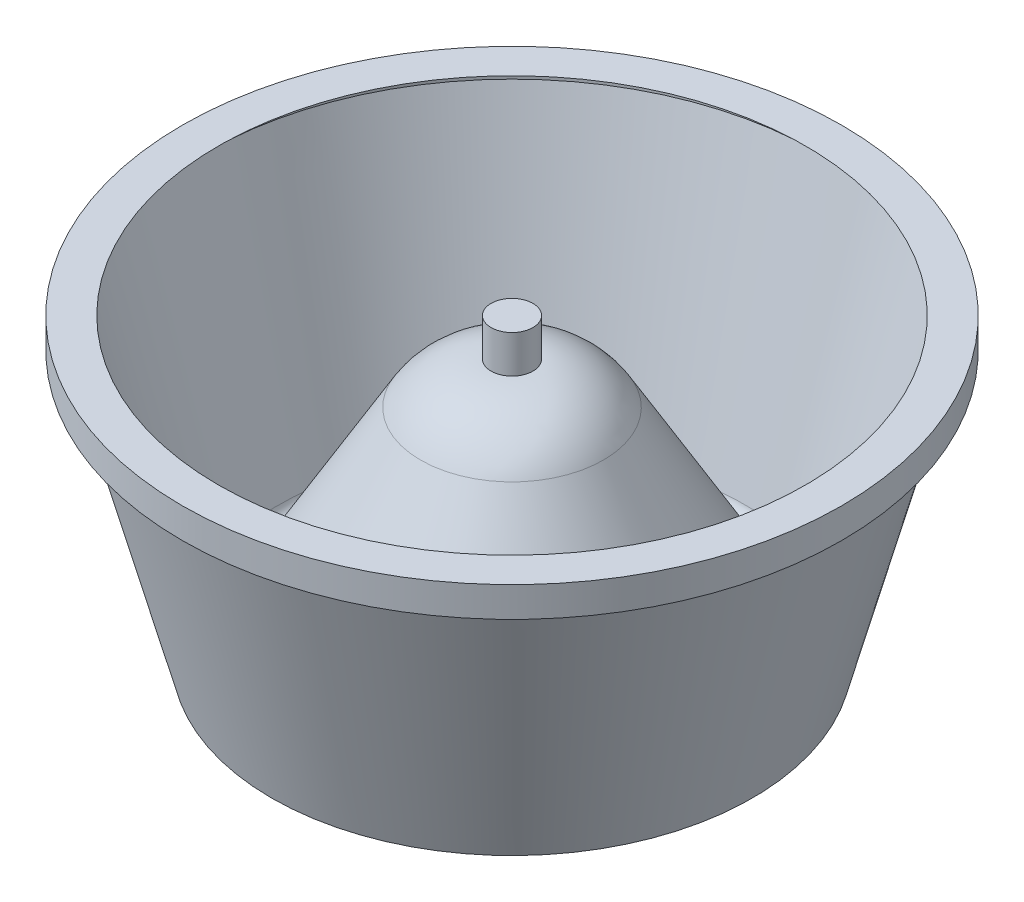
ISO-10303-21;
HEADER;
FILE_DESCRIPTION(('STEP AP214'),'2;1');
FILE_NAME('part.step','',(''),(''),'','','');
FILE_SCHEMA(('AUTOMOTIVE_DESIGN { 1 0 10303 214 1 1 1 1 }'));
ENDSEC;
DATA;
#1=APPLICATION_CONTEXT('core data for automotive mechanical design processes');
#2=APPLICATION_PROTOCOL_DEFINITION('international standard','automotive_design',2000,#1);
#3=PRODUCT_CONTEXT('',#1,'mechanical');
#4=PRODUCT('Part','Part','',(#3));
#5=PRODUCT_RELATED_PRODUCT_CATEGORY('part','',(#4));
#6=PRODUCT_DEFINITION_FORMATION('','',#4);
#7=PRODUCT_DEFINITION_CONTEXT('part definition',#1,'design');
#8=PRODUCT_DEFINITION('design','',#6,#7);
#9=PRODUCT_DEFINITION_SHAPE('','',#8);
#10=(LENGTH_UNIT() NAMED_UNIT(*) SI_UNIT(.MILLI.,.METRE.));
#11=(NAMED_UNIT(*) PLANE_ANGLE_UNIT() SI_UNIT($,.RADIAN.));
#12=(NAMED_UNIT(*) SI_UNIT($,.STERADIAN.) SOLID_ANGLE_UNIT());
#13=UNCERTAINTY_MEASURE_WITH_UNIT(LENGTH_MEASURE(1.E-05),#10,'distance_accuracy_value','');
#14=(GEOMETRIC_REPRESENTATION_CONTEXT(3) GLOBAL_UNCERTAINTY_ASSIGNED_CONTEXT((#13)) GLOBAL_UNIT_ASSIGNED_CONTEXT((#10,
#11,#12)) REPRESENTATION_CONTEXT('',''));
#15=CARTESIAN_POINT('',(0.,0.,0.));
#16=DIRECTION('',(0.,0.,1.));
#17=DIRECTION('',(1.,0.,0.));
#18=AXIS2_PLACEMENT_3D('',#15,#16,#17);
#19=CARTESIAN_POINT('',(0.,37.5,0.));
#20=DIRECTION('',(0.,1.,0.));
#21=DIRECTION('',(-0.00319420156689542,0.,0.999994898525163));
#22=AXIS2_PLACEMENT_3D('',#19,#20,#21);
#23=PLANE('',#22);
#24=CARTESIAN_POINT('',(0.,37.5,0.));
#25=DIRECTION('',(0.,1.,0.));
#26=DIRECTION('',(-0.00319420156689542,0.,0.999994898525163));
#27=AXIS2_PLACEMENT_3D('',#24,#25,#26);
#28=CIRCLE('',#27,80.);
#29=CARTESIAN_POINT('',(-0.255536125351645,37.5,79.999591882013));
#30=VERTEX_POINT('',#29);
#31=EDGE_CURVE('E50',#30,#30,#28,.T.);
#32=ORIENTED_EDGE('',*,*,#31,.T.);
#33=EDGE_LOOP('',(#32));
#34=FACE_BOUND('',#33,.T.);
#35=CARTESIAN_POINT('',(0.,37.5,0.));
#36=DIRECTION('',(0.,1.,0.));
#37=DIRECTION('',(0.,0.,1.));
#38=AXIS2_PLACEMENT_3D('',#35,#36,#37);
#39=CIRCLE('',#38,71.2513108531376);
#40=CARTESIAN_POINT('',(0.,37.5,71.2513108531377));
#41=VERTEX_POINT('',#40);
#42=EDGE_CURVE('E37',#41,#41,#39,.T.);
#43=ORIENTED_EDGE('',*,*,#42,.F.);
#44=EDGE_LOOP('',(#43));
#45=FACE_BOUND('',#44,.T.);
#46=ADVANCED_FACE('F33',(#34,#45),#23,.T.);
#47=CARTESIAN_POINT('',(0.,37.5,0.));
#48=DIRECTION('',(0.,1.,0.));
#49=DIRECTION('',(0.,0.,1.));
#50=AXIS2_PLACEMENT_3D('',#47,#48,#49);
#51=CIRCLE('',#50,5.07840908288413);
#52=CARTESIAN_POINT('',(0.,37.5,5.07840908288415));
#53=VERTEX_POINT('',#52);
#54=EDGE_CURVE('E53',#53,#53,#51,.T.);
#55=ORIENTED_EDGE('',*,*,#54,.T.);
#56=EDGE_LOOP('',(#55));
#57=FACE_BOUND('',#56,.T.);
#58=ADVANCED_FACE('F94',(#57),#23,.T.);
#59=CARTESIAN_POINT('',(0.,-29.7971455333949,0.));
#60=DIRECTION('',(0.,1.,0.));
#61=DIRECTION('',(0.,0.,1.));
#62=AXIS2_PLACEMENT_3D('',#59,#60,#61);
#63=TOROIDAL_SURFACE('',#62,53.6852904935057,3.);
#64=CARTESIAN_POINT('',(0.,-31.3094571423734,0.));
#65=DIRECTION('',(0.,1.,0.));
#66=DIRECTION('',(0.,0.,1.));
#67=AXIS2_PLACEMENT_3D('',#64,#65,#66);
#68=CIRCLE('',#67,51.0943613942541);
#69=CARTESIAN_POINT('',(0.,-31.3094571423734,51.0943613942541));
#70=VERTEX_POINT('',#69);
#71=EDGE_CURVE('E71',#70,#70,#68,.T.);
#72=ORIENTED_EDGE('',*,*,#71,.F.);
#73=EDGE_LOOP('',(#72));
#74=FACE_BOUND('',#73,.T.);
#75=CARTESIAN_POINT('',(0.,-30.5811702491781,0.));
#76=DIRECTION('',(0.,1.,0.));
#77=DIRECTION('',(0.,0.,1.));
#78=AXIS2_PLACEMENT_3D('',#75,#76,#77);
#79=CIRCLE('',#78,56.5810296469933);
#80=CARTESIAN_POINT('',(0.,-30.5811702491781,56.5810296469933));
#81=VERTEX_POINT('',#80);
#82=EDGE_CURVE('E74',#81,#81,#79,.T.);
#83=ORIENTED_EDGE('',*,*,#82,.T.);
#84=EDGE_LOOP('',(#83));
#85=FACE_BOUND('',#84,.T.);
#86=ADVANCED_FACE('F96',(#74,#85),#63,.F.);
#87=CARTESIAN_POINT('',(0.,-31.3094571423734,0.));
#88=DIRECTION('',(0.,-1.,0.));
#89=DIRECTION('',(0.,0.,-1.));
#90=AXIS2_PLACEMENT_3D('',#87,#88,#89);
#91=CONICAL_SURFACE('',#90,51.0943613942541,0.52834403413605);
#92=CARTESIAN_POINT('',(0.,18.2052123543031,0.));
#93=DIRECTION('',(0.,1.,0.));
#94=DIRECTION('',(0.,0.,1.));
#95=AXIS2_PLACEMENT_3D('',#92,#93,#94);
#96=CIRCLE('',#95,22.1929107462273);
#97=CARTESIAN_POINT('',(0.,18.2052123543031,22.1929107462273));
#98=VERTEX_POINT('',#97);
#99=EDGE_CURVE('E52',#98,#98,#96,.T.);
#100=ORIENTED_EDGE('',*,*,#99,.F.);
#101=EDGE_LOOP('',(#100));
#102=FACE_BOUND('',#101,.T.);
#103=ORIENTED_EDGE('',*,*,#71,.T.);
#104=EDGE_LOOP('',(#103));
#105=FACE_BOUND('',#104,.T.);
#106=ADVANCED_FACE('F105',(#102,#105),#91,.T.);
#107=CARTESIAN_POINT('',(0.,7.89657719946323,0.));
#108=DIRECTION('',(0.,1.,0.));
#109=DIRECTION('',(0.,0.,1.));
#110=AXIS2_PLACEMENT_3D('',#107,#108,#109);
#111=DEGENERATE_TOROIDAL_SURFACE('',#110,4.53190580672045,20.4494267457277,.T.);
#112=CARTESIAN_POINT('',(0.,28.3387000930873,0.));
#113=DIRECTION('',(0.,1.,0.));
#114=DIRECTION('',(0.,0.,1.));
#115=AXIS2_PLACEMENT_3D('',#112,#113,#114);
#116=CIRCLE('',#115,5.07840908288413);
#117=CARTESIAN_POINT('',(0.,28.3387000930873,5.07840908288415));
#118=VERTEX_POINT('',#117);
#119=EDGE_CURVE('E10',#118,#118,#116,.T.);
#120=ORIENTED_EDGE('',*,*,#119,.F.);
#121=EDGE_LOOP('',(#120));
#122=FACE_BOUND('',#121,.T.);
#123=ORIENTED_EDGE('',*,*,#99,.T.);
#124=EDGE_LOOP('',(#123));
#125=FACE_BOUND('',#124,.T.);
#126=ADVANCED_FACE('F112',(#122,#125),#111,.T.);
#127=CARTESIAN_POINT('',(0.,0.,0.));
#128=DIRECTION('',(0.,1.,0.));
#129=DIRECTION('',(0.,0.,1.));
#130=AXIS2_PLACEMENT_3D('',#127,#128,#129);
#131=CYLINDRICAL_SURFACE('',#130,5.07840908288413);
#132=ORIENTED_EDGE('',*,*,#54,.F.);
#133=EDGE_LOOP('',(#132));
#134=FACE_BOUND('',#133,.T.);
#135=ORIENTED_EDGE('',*,*,#119,.T.);
#136=EDGE_LOOP('',(#135));
#137=FACE_BOUND('',#136,.T.);
#138=ADVANCED_FACE('F120',(#134,#137),#131,.T.);
#139=CARTESIAN_POINT('',(0.,34.6650938751586,0.));
#140=DIRECTION('',(0.,1.,0.));
#141=DIRECTION('',(0.,0.,1.));
#142=AXIS2_PLACEMENT_3D('',#139,#140,#141);
#143=CONICAL_SURFACE('',#142,74.2465309143948,0.264411817054796);
#144=ORIENTED_EDGE('',*,*,#82,.F.);
#145=EDGE_LOOP('',(#144));
#146=FACE_BOUND('',#145,.T.);
#147=CARTESIAN_POINT('',(0.,34.6650938751586,0.));
#148=DIRECTION('',(0.,1.,0.));
#149=DIRECTION('',(0.,0.,1.));
#150=AXIS2_PLACEMENT_3D('',#147,#148,#149);
#151=CIRCLE('',#150,74.2465309143948);
#152=CARTESIAN_POINT('',(0.,34.6650938751585,74.2465309143948));
#153=VERTEX_POINT('',#152);
#154=EDGE_CURVE('E46',#153,#153,#151,.T.);
#155=ORIENTED_EDGE('',*,*,#154,.T.);
#156=EDGE_LOOP('',(#155));
#157=FACE_BOUND('',#156,.T.);
#158=ADVANCED_FACE('F79',(#146,#157),#143,.F.);
#159=CARTESIAN_POINT('',(0.,0.,0.));
#160=DIRECTION('',(0.,1.,0.));
#161=DIRECTION('',(0.,0.,1.));
#162=AXIS2_PLACEMENT_3D('',#159,#160,#161);
#163=CYLINDRICAL_SURFACE('',#162,74.2465309143948);
#164=ORIENTED_EDGE('',*,*,#154,.F.);
#165=EDGE_LOOP('',(#164));
#166=FACE_BOUND('',#165,.T.);
#167=CARTESIAN_POINT('',(0.,37.3932662954329,0.));
#168=DIRECTION('',(0.,1.,0.));
#169=DIRECTION('',(0.,0.,1.));
#170=AXIS2_PLACEMENT_3D('',#167,#168,#169);
#171=CIRCLE('',#170,74.2465309143948);
#172=CARTESIAN_POINT('',(0.,37.3932662954329,74.2465309143948));
#173=VERTEX_POINT('',#172);
#174=EDGE_CURVE('E41',#173,#173,#171,.T.);
#175=ORIENTED_EDGE('',*,*,#174,.T.);
#176=EDGE_LOOP('',(#175));
#177=FACE_BOUND('',#176,.T.);
#178=ADVANCED_FACE('F81',(#166,#177),#163,.F.);
#179=CARTESIAN_POINT('',(0.,37.5,0.));
#180=DIRECTION('',(0.,-1.,0.));
#181=DIRECTION('',(0.,0.,-1.));
#182=AXIS2_PLACEMENT_3D('',#179,#180,#181);
#183=CONICAL_SURFACE('',#182,71.2513108531376,1.53517671992909);
#184=ORIENTED_EDGE('',*,*,#174,.F.);
#185=EDGE_LOOP('',(#184));
#186=FACE_BOUND('',#185,.T.);
#187=ORIENTED_EDGE('',*,*,#42,.T.);
#188=EDGE_LOOP('',(#187));
#189=FACE_BOUND('',#188,.T.);
#190=ADVANCED_FACE('F84',(#186,#189),#183,.F.);
#191=CARTESIAN_POINT('',(0.,-34.7711569371554,0.));
#192=DIRECTION('',(0.,-1.,0.));
#193=DIRECTION('',(0.00319420156689542,0.,-0.999994898525163));
#194=AXIS2_PLACEMENT_3D('',#191,#192,#193);
#195=CYLINDRICAL_SURFACE('',#194,80.);
#196=CARTESIAN_POINT('',(0.,30.1928950130274,0.));
#197=DIRECTION('',(0.,1.,0.));
#198=DIRECTION('',(0.,0.,1.));
#199=AXIS2_PLACEMENT_3D('',#196,#197,#198);
#200=CIRCLE('',#199,80.);
#201=CARTESIAN_POINT('',(0.,30.1928950130274,80.));
#202=VERTEX_POINT('',#201);
#203=EDGE_CURVE('E55',#202,#202,#200,.T.);
#204=ORIENTED_EDGE('',*,*,#203,.T.);
#205=EDGE_LOOP('',(#204));
#206=FACE_BOUND('',#205,.T.);
#207=ORIENTED_EDGE('',*,*,#31,.F.);
#208=EDGE_LOOP('',(#207));
#209=FACE_BOUND('',#208,.T.);
#210=ADVANCED_FACE('F35',(#206,#209),#195,.T.);
#211=CARTESIAN_POINT('',(0.,30.1928950130274,80.));
#212=DIRECTION('',(0.,1.,0.));
#213=DIRECTION('',(0.,0.,1.));
#214=AXIS2_PLACEMENT_3D('',#211,#212,#213);
#215=PLANE('',#214);
#216=ORIENTED_EDGE('',*,*,#203,.F.);
#217=EDGE_LOOP('',(#216));
#218=FACE_BOUND('',#217,.T.);
#219=CARTESIAN_POINT('',(0.,30.1928950130274,0.));
#220=DIRECTION('',(0.,1.,0.));
#221=DIRECTION('',(0.,0.,1.));
#222=AXIS2_PLACEMENT_3D('',#219,#220,#221);
#223=CIRCLE('',#222,75.6331313512779);
#224=CARTESIAN_POINT('',(0.,30.1928950130274,75.6331313512779));
#225=VERTEX_POINT('',#224);
#226=EDGE_CURVE('E60',#225,#225,#223,.T.);
#227=ORIENTED_EDGE('',*,*,#226,.T.);
#228=EDGE_LOOP('',(#227));
#229=FACE_BOUND('',#228,.T.);
#230=ADVANCED_FACE('F101',(#218,#229),#215,.F.);
#231=CARTESIAN_POINT('',(0.,-34.7711569371554,0.));
#232=DIRECTION('',(0.,1.,0.));
#233=DIRECTION('',(0.,0.,1.));
#234=AXIS2_PLACEMENT_3D('',#231,#232,#233);
#235=CONICAL_SURFACE('',#234,58.3227315701756,0.260410563994633);
#236=ORIENTED_EDGE('',*,*,#226,.F.);
#237=EDGE_LOOP('',(#236));
#238=FACE_BOUND('',#237,.T.);
#239=CARTESIAN_POINT('',(0.,-34.7711569371554,0.));
#240=DIRECTION('',(0.,1.,0.));
#241=DIRECTION('',(0.,0.,1.));
#242=AXIS2_PLACEMENT_3D('',#239,#240,#241);
#243=CIRCLE('',#242,58.3227315701756);
#244=CARTESIAN_POINT('',(0.,-34.7711569371554,58.3227315701756));
#245=VERTEX_POINT('',#244);
#246=EDGE_CURVE('E65',#245,#245,#243,.T.);
#247=ORIENTED_EDGE('',*,*,#246,.T.);
#248=EDGE_LOOP('',(#247));
#249=FACE_BOUND('',#248,.T.);
#250=ADVANCED_FACE('F137',(#238,#249),#235,.T.);
#251=CARTESIAN_POINT('',(0.,-34.7711569371554,0.));
#252=DIRECTION('',(0.,1.,0.));
#253=DIRECTION('',(-0.00319420156689542,0.,0.999994898525163));
#254=AXIS2_PLACEMENT_3D('',#251,#252,#253);
#255=PLANE('',#254);
#256=CARTESIAN_POINT('',(0.,-34.7711569371554,0.));
#257=DIRECTION('',(0.,-1.,0.));
#258=DIRECTION('',(0.,0.,-1.));
#259=AXIS2_PLACEMENT_3D('',#256,#257,#258);
#260=CIRCLE('',#259,46.7761462288347);
#261=CARTESIAN_POINT('',(0.,-34.7711569371554,-46.7761462288347));
#262=VERTEX_POINT('',#261);
#263=EDGE_CURVE('E164',#262,#262,#260,.T.);
#264=ORIENTED_EDGE('',*,*,#263,.F.);
#265=EDGE_LOOP('',(#264));
#266=FACE_BOUND('',#265,.T.);
#267=ORIENTED_EDGE('',*,*,#246,.F.);
#268=EDGE_LOOP('',(#267));
#269=FACE_BOUND('',#268,.T.);
#270=ADVANCED_FACE('F133',(#266,#269),#255,.F.);
#271=CARTESIAN_POINT('',(0.,23.3404859260582,4.94478595423634));
#272=DIRECTION('',(0.,-1.,0.));
#273=DIRECTION('',(0.,0.,-1.));
#274=AXIS2_PLACEMENT_3D('',#271,#272,#273);
#275=PLANE('',#274);
#276=CARTESIAN_POINT('',(0.,23.3404859260582,0.));
#277=DIRECTION('',(0.,-1.,0.));
#278=DIRECTION('',(0.,0.,-1.));
#279=AXIS2_PLACEMENT_3D('',#276,#277,#278);
#280=CIRCLE('',#279,4.94478595423634);
#281=CARTESIAN_POINT('',(0.,23.3404859260582,-4.94478595423634));
#282=VERTEX_POINT('',#281);
#283=EDGE_CURVE('E171',#282,#282,#280,.T.);
#284=ORIENTED_EDGE('',*,*,#283,.T.);
#285=EDGE_LOOP('',(#284));
#286=FACE_BOUND('',#285,.T.);
#287=ADVANCED_FACE('F136',(#286),#275,.T.);
#288=CARTESIAN_POINT('',(0.,7.89657719946323,0.));
#289=DIRECTION('',(0.,-1.,0.));
#290=DIRECTION('',(0.,0.,-1.));
#291=AXIS2_PLACEMENT_3D('',#288,#289,#290);
#292=DEGENERATE_TOROIDAL_SURFACE('',#291,4.53190580672045,15.4494267457277,.T.);
#293=CARTESIAN_POINT('',(0.,15.6846930060055,0.));
#294=DIRECTION('',(0.,-1.,0.));
#295=DIRECTION('',(0.,0.,-1.));
#296=AXIS2_PLACEMENT_3D('',#293,#294,#295);
#297=CIRCLE('',#296,17.8746955808079);
#298=CARTESIAN_POINT('',(0.,15.6846930060055,-17.8746955808079));
#299=VERTEX_POINT('',#298);
#300=EDGE_CURVE('E168',#299,#299,#297,.T.);
#301=ORIENTED_EDGE('',*,*,#300,.T.);
#302=EDGE_LOOP('',(#301));
#303=FACE_BOUND('',#302,.T.);
#304=ORIENTED_EDGE('',*,*,#283,.F.);
#305=EDGE_LOOP('',(#304));
#306=FACE_BOUND('',#305,.T.);
#307=ADVANCED_FACE('F147',(#303,#306),#292,.F.);
#308=CARTESIAN_POINT('',(0.,15.6846930060055,0.));
#309=DIRECTION('',(0.,-1.,0.));
#310=DIRECTION('',(0.,0.,-1.));
#311=AXIS2_PLACEMENT_3D('',#308,#309,#310);
#312=CONICAL_SURFACE('',#311,17.8746955808079,0.52834403413605);
#313=CARTESIAN_POINT('',(0.,-33.8299764906709,0.));
#314=DIRECTION('',(0.,-1.,0.));
#315=DIRECTION('',(0.,0.,-1.));
#316=AXIS2_PLACEMENT_3D('',#313,#314,#315);
#317=CIRCLE('',#316,46.7761462288347);
#318=CARTESIAN_POINT('',(0.,-33.8299764906709,-46.7761462288347));
#319=VERTEX_POINT('',#318);
#320=EDGE_CURVE('E167',#319,#319,#317,.T.);
#321=ORIENTED_EDGE('',*,*,#320,.T.);
#322=EDGE_LOOP('',(#321));
#323=FACE_BOUND('',#322,.T.);
#324=ORIENTED_EDGE('',*,*,#300,.F.);
#325=EDGE_LOOP('',(#324));
#326=FACE_BOUND('',#325,.T.);
#327=ADVANCED_FACE('F151',(#323,#326),#312,.F.);
#328=CARTESIAN_POINT('',(0.,23.3404859260582,0.));
#329=DIRECTION('',(0.,-1.,0.));
#330=DIRECTION('',(0.,0.,-1.));
#331=AXIS2_PLACEMENT_3D('',#328,#329,#330);
#332=CYLINDRICAL_SURFACE('',#331,46.7761462288347);
#333=ORIENTED_EDGE('',*,*,#263,.T.);
#334=EDGE_LOOP('',(#333));
#335=FACE_BOUND('',#334,.T.);
#336=ORIENTED_EDGE('',*,*,#320,.F.);
#337=EDGE_LOOP('',(#336));
#338=FACE_BOUND('',#337,.T.);
#339=ADVANCED_FACE('F155',(#335,#338),#332,.F.);
#340=CLOSED_SHELL('',(#46,#58,#86,#106,#126,#138,#158,#178,#190,#210,#230,#250,#270,#287,#307,
#327,#339));
#341=MANIFOLD_SOLID_BREP('B2',#340);
#342=ADVANCED_BREP_SHAPE_REPRESENTATION('',(#18,#341),#14);
#343=SHAPE_DEFINITION_REPRESENTATION(#9,#342);
ENDSEC;
END-ISO-10303-21;
